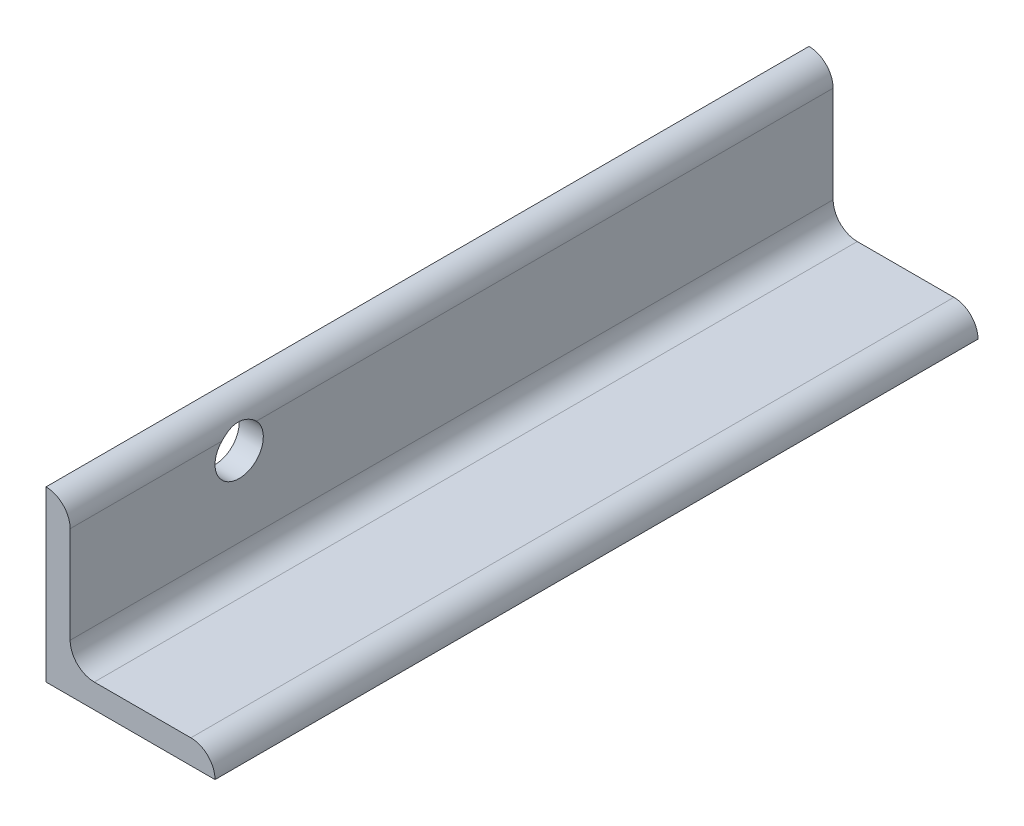
ISO-10303-21;
HEADER;
FILE_DESCRIPTION(('STEP AP214'),'2;1');
FILE_NAME('part.step','',(''),(''),'','','');
FILE_SCHEMA(('AUTOMOTIVE_DESIGN { 1 0 10303 214 1 1 1 1 }'));
ENDSEC;
DATA;
#1=APPLICATION_CONTEXT('core data for automotive mechanical design processes');
#2=APPLICATION_PROTOCOL_DEFINITION('international standard','automotive_design',2000,#1);
#3=PRODUCT_CONTEXT('',#1,'mechanical');
#4=PRODUCT('Part','Part','',(#3));
#5=PRODUCT_RELATED_PRODUCT_CATEGORY('part','',(#4));
#6=PRODUCT_DEFINITION_FORMATION('','',#4);
#7=PRODUCT_DEFINITION_CONTEXT('part definition',#1,'design');
#8=PRODUCT_DEFINITION('design','',#6,#7);
#9=PRODUCT_DEFINITION_SHAPE('','',#8);
#10=(LENGTH_UNIT() NAMED_UNIT(*) SI_UNIT(.MILLI.,.METRE.));
#11=(NAMED_UNIT(*) PLANE_ANGLE_UNIT() SI_UNIT($,.RADIAN.));
#12=(NAMED_UNIT(*) SI_UNIT($,.STERADIAN.) SOLID_ANGLE_UNIT());
#13=UNCERTAINTY_MEASURE_WITH_UNIT(LENGTH_MEASURE(1.E-05),#10,'distance_accuracy_value','');
#14=(GEOMETRIC_REPRESENTATION_CONTEXT(3) GLOBAL_UNCERTAINTY_ASSIGNED_CONTEXT((#13)) GLOBAL_UNIT_ASSIGNED_CONTEXT((#10,
#11,#12)) REPRESENTATION_CONTEXT('',''));
#15=CARTESIAN_POINT('',(0.,0.,0.));
#16=DIRECTION('',(0.,0.,1.));
#17=DIRECTION('',(1.,0.,0.));
#18=AXIS2_PLACEMENT_3D('',#15,#16,#17);
#19=CARTESIAN_POINT('',(0.,35.,-79.));
#20=DIRECTION('',(1.,0.,0.));
#21=DIRECTION('',(0.,0.,-1.));
#22=AXIS2_PLACEMENT_3D('',#19,#20,#21);
#23=PLANE('',#22);
#24=CARTESIAN_POINT('',(0.,26.5,44.));
#25=DIRECTION('',(-1.,0.,0.));
#26=DIRECTION('',(0.,0.,1.));
#27=AXIS2_PLACEMENT_3D('',#24,#25,#26);
#28=CIRCLE('',#27,4.99999999999999);
#29=CARTESIAN_POINT('',(0.,26.5,49.));
#30=VERTEX_POINT('',#29);
#31=EDGE_CURVE('E237',#30,#30,#28,.T.);
#32=ORIENTED_EDGE('',*,*,#31,.F.);
#33=EDGE_LOOP('',(#32));
#34=FACE_BOUND('',#33,.T.);
#35=DIRECTION('',(0.,1.,0.));
#36=VECTOR('',#35,1.);
#37=CARTESIAN_POINT('',(0.,35.,79.));
#38=LINE('',#37,#36);
#39=CARTESIAN_POINT('',(0.,0.,79.));
#40=VERTEX_POINT('',#39);
#41=CARTESIAN_POINT('',(0.,35.,79.));
#42=VERTEX_POINT('',#41);
#43=EDGE_CURVE('E168',#40,#42,#38,.T.);
#44=ORIENTED_EDGE('',*,*,#43,.T.);
#45=DIRECTION('',(0.,0.,1.));
#46=VECTOR('',#45,1.);
#47=CARTESIAN_POINT('',(0.,35.,-79.));
#48=LINE('',#47,#46);
#49=CARTESIAN_POINT('',(0.,35.,-79.));
#50=VERTEX_POINT('',#49);
#51=EDGE_CURVE('E72',#50,#42,#48,.T.);
#52=ORIENTED_EDGE('',*,*,#51,.F.);
#53=DIRECTION('',(0.,1.,0.));
#54=VECTOR('',#53,1.);
#55=CARTESIAN_POINT('',(0.,35.,-79.));
#56=LINE('',#55,#54);
#57=CARTESIAN_POINT('',(0.,0.,-79.));
#58=VERTEX_POINT('',#57);
#59=EDGE_CURVE('E189',#58,#50,#56,.T.);
#60=ORIENTED_EDGE('',*,*,#59,.F.);
#61=DIRECTION('',(0.,0.,1.));
#62=VECTOR('',#61,1.);
#63=CARTESIAN_POINT('',(0.,0.,-79.));
#64=LINE('',#63,#62);
#65=EDGE_CURVE('E164',#58,#40,#64,.T.);
#66=ORIENTED_EDGE('',*,*,#65,.T.);
#67=EDGE_LOOP('',(#44,#52,#60,#66));
#68=FACE_BOUND('',#67,.T.);
#69=ADVANCED_FACE('F64',(#34,#68),#23,.F.);
#70=CARTESIAN_POINT('',(0.,30.,-79.));
#71=DIRECTION('',(0.,0.,1.));
#72=DIRECTION('',(0.,-1.,0.));
#73=AXIS2_PLACEMENT_3D('',#70,#71,#72);
#74=CYLINDRICAL_SURFACE('',#73,5.);
#75=DIRECTION('',(0.,0.,1.));
#76=VECTOR('',#75,1.);
#77=CARTESIAN_POINT('',(5.,30.,-79.));
#78=LINE('',#77,#76);
#79=CARTESIAN_POINT('',(5.,30.,47.5707142142714));
#80=VERTEX_POINT('',#79);
#81=CARTESIAN_POINT('',(5.,30.,79.));
#82=VERTEX_POINT('',#81);
#83=EDGE_CURVE('E200',#80,#82,#78,.T.);
#84=ORIENTED_EDGE('',*,*,#83,.F.);
#85=CARTESIAN_POINT('',(5.,30.,47.5707142142714));
#86=CARTESIAN_POINT('',(4.9999955252737,30.0992819849625,47.473423434583));
#87=CARTESIAN_POINT('',(4.99704325014133,30.1944403785129,47.3720089482987));
#88=CARTESIAN_POINT('',(4.98668256702425,30.3758392116425,47.1618158888214));
#89=CARTESIAN_POINT('',(4.97927715991236,30.4620856110049,47.0530423185313));
#90=CARTESIAN_POINT('',(4.96144893950854,30.6250963501032,46.8289206121453));
#91=CARTESIAN_POINT('',(4.95102718684203,30.7018640092974,46.713574798451));
#92=CARTESIAN_POINT('',(4.92852787951654,30.8455181978565,46.4770183665137));
#93=CARTESIAN_POINT('',(4.91645005287137,30.9124031003649,46.3558067870238));
#94=CARTESIAN_POINT('',(4.89194044083007,31.035795022588,46.1084681135975));
#95=CARTESIAN_POINT('',(4.87950919105075,31.0923168705965,45.9823483611503));
#96=CARTESIAN_POINT('',(4.85544416888814,31.1947517955454,45.7257988298954));
#97=CARTESIAN_POINT('',(4.84381037792748,31.2406651196779,45.5953691515955));
#98=CARTESIAN_POINT('',(4.82237213651918,31.3215440043627,45.3310888911166));
#99=CARTESIAN_POINT('',(4.81256664634913,31.3565157948914,45.1972403027589));
#100=CARTESIAN_POINT('',(4.79561664717994,31.4152731219617,44.9269398601492));
#101=CARTESIAN_POINT('',(4.78847212835649,31.4390586998029,44.7904880155104));
#102=CARTESIAN_POINT('',(4.77740116692676,31.475399769562,44.5146996377305));
#103=CARTESIAN_POINT('',(4.77350452904374,31.4878513467612,44.3753481621218));
#104=CARTESIAN_POINT('',(4.76937628726945,31.5010323459869,44.0960355167987));
#105=CARTESIAN_POINT('',(4.76914470761678,31.5017616904893,43.9560743430583));
#106=CARTESIAN_POINT('',(4.77236719888181,31.4914891406126,43.6765868105425));
#107=CARTESIAN_POINT('',(4.7758223207435,31.4804839011326,43.5370605871297));
#108=CARTESIAN_POINT('',(4.78612026343925,31.4468449187905,43.2595514866308));
#109=CARTESIAN_POINT('',(4.79296302165411,31.4242113908725,43.1215685810654));
#110=CARTESIAN_POINT('',(4.80914542675123,31.3685497131437,42.8531274217182));
#111=CARTESIAN_POINT('',(4.81838493073622,31.3359306790842,42.7225782526745));
#112=CARTESIAN_POINT('',(4.83870619122663,31.2603341486235,42.4646470716953));
#113=CARTESIAN_POINT('',(4.84978864323665,31.2173527388317,42.3372662764053));
#114=CARTESIAN_POINT('',(4.88444592948586,31.0733233823651,41.9612221130374));
#115=CARTESIAN_POINT('',(4.90945709091694,30.9571142603212,41.7182925025755));
#116=CARTESIAN_POINT('',(4.95066993631903,30.7097562793251,41.2929834930599));
#117=CARTESIAN_POINT('',(4.96764565287441,30.5843912878894,41.1072858051597));
#118=CARTESIAN_POINT('',(4.98614159453619,30.3783500662403,40.8423220737439));
#119=CARTESIAN_POINT('',(4.99114604134407,30.3066491489386,40.7562434569024));
#120=CARTESIAN_POINT('',(4.99807507563759,30.1575291307995,40.5889806170967));
#121=CARTESIAN_POINT('',(4.99999800328477,30.0801069717261,40.5077990545358));
#122=CARTESIAN_POINT('',(5.,30.,40.4292857857286));
#123=B_SPLINE_CURVE_WITH_KNOTS('',3,(#85,#86,#87,#88,#89,#90,#91,#92,#93,#94,#95,#96,#97,#98,
#99,#100,#101,#102,#103,#104,#105,#106,#107,#108,#109,#110,#111,#112,#113,#114,#115,#116,#117,
#118,#119,#120,#121,#122),.UNSPECIFIED.,.F.,.F.,(4,2,2,2,2,2,2,2,2,2,2,2,2,2,2,2,2,2,4),(0.,
0.416779785975336,0.833279026987509,1.24963199360785,1.66605342226771,2.08187427044305,
2.49768542847917,2.91325939599305,3.32883182919225,3.74817710786149,4.16752515984134,
4.58699278458508,5.00645265591687,5.41061761437841,5.8149354470259,6.62246422936048,
7.29441636826766,7.63057203833212,7.96690871547757),.UNSPECIFIED.);
#124=CARTESIAN_POINT('',(5.,30.,40.4292857857286));
#125=VERTEX_POINT('',#124);
#126=EDGE_CURVE('E78',#80,#125,#123,.T.);
#127=ORIENTED_EDGE('',*,*,#126,.T.);
#128=CARTESIAN_POINT('',(5.,30.,-79.));
#129=VERTEX_POINT('',#128);
#130=EDGE_CURVE('E201',#129,#125,#78,.T.);
#131=ORIENTED_EDGE('',*,*,#130,.F.);
#132=CARTESIAN_POINT('',(0.,30.,-79.));
#133=DIRECTION('',(0.,0.,-1.));
#134=DIRECTION('',(0.,1.,0.));
#135=AXIS2_PLACEMENT_3D('',#132,#133,#134);
#136=CIRCLE('',#135,5.);
#137=EDGE_CURVE('E125',#50,#129,#136,.T.);
#138=ORIENTED_EDGE('',*,*,#137,.F.);
#139=ORIENTED_EDGE('',*,*,#51,.T.);
#140=CARTESIAN_POINT('',(0.,30.,79.));
#141=DIRECTION('',(0.,0.,-1.));
#142=DIRECTION('',(0.,1.,0.));
#143=AXIS2_PLACEMENT_3D('',#140,#141,#142);
#144=CIRCLE('',#143,5.);
#145=EDGE_CURVE('E172',#42,#82,#144,.T.);
#146=ORIENTED_EDGE('',*,*,#145,.T.);
#147=EDGE_LOOP('',(#84,#127,#131,#138,#139,#146));
#148=FACE_BOUND('',#147,.T.);
#149=ADVANCED_FACE('F207',(#148),#74,.T.);
#150=CARTESIAN_POINT('',(5.,10.,-79.));
#151=DIRECTION('',(-1.,0.,0.));
#152=DIRECTION('',(0.,-1.,0.));
#153=AXIS2_PLACEMENT_3D('',#150,#151,#152);
#154=PLANE('',#153);
#155=ORIENTED_EDGE('',*,*,#130,.T.);
#156=CARTESIAN_POINT('',(5.,26.5,44.));
#157=DIRECTION('',(-1.,0.,0.));
#158=DIRECTION('',(0.,-1.,0.));
#159=AXIS2_PLACEMENT_3D('',#156,#157,#158);
#160=CIRCLE('',#159,4.99999999999999);
#161=EDGE_CURVE('E13',#125,#80,#160,.T.);
#162=ORIENTED_EDGE('',*,*,#161,.T.);
#163=ORIENTED_EDGE('',*,*,#83,.T.);
#164=DIRECTION('',(0.,-1.,0.));
#165=VECTOR('',#164,1.);
#166=CARTESIAN_POINT('',(5.,10.,79.));
#167=LINE('',#166,#165);
#168=CARTESIAN_POINT('',(5.,10.,79.));
#169=VERTEX_POINT('',#168);
#170=EDGE_CURVE('E176',#82,#169,#167,.T.);
#171=ORIENTED_EDGE('',*,*,#170,.T.);
#172=DIRECTION('',(0.,0.,1.));
#173=VECTOR('',#172,1.);
#174=CARTESIAN_POINT('',(5.,10.,-79.));
#175=LINE('',#174,#173);
#176=CARTESIAN_POINT('',(5.,10.,-79.));
#177=VERTEX_POINT('',#176);
#178=EDGE_CURVE('E196',#177,#169,#175,.T.);
#179=ORIENTED_EDGE('',*,*,#178,.F.);
#180=DIRECTION('',(0.,-1.,0.));
#181=VECTOR('',#180,1.);
#182=CARTESIAN_POINT('',(5.,10.,-79.));
#183=LINE('',#182,#181);
#184=EDGE_CURVE('E222',#129,#177,#183,.T.);
#185=ORIENTED_EDGE('',*,*,#184,.F.);
#186=EDGE_LOOP('',(#155,#162,#163,#171,#179,#185));
#187=FACE_BOUND('',#186,.T.);
#188=ADVANCED_FACE('F217',(#187),#154,.F.);
#189=CARTESIAN_POINT('',(10.,10.,-79.));
#190=DIRECTION('',(0.,0.,1.));
#191=DIRECTION('',(0.,-1.,0.));
#192=AXIS2_PLACEMENT_3D('',#189,#190,#191);
#193=CYLINDRICAL_SURFACE('',#192,5.);
#194=CARTESIAN_POINT('',(10.,10.,79.));
#195=DIRECTION('',(0.,0.,1.));
#196=DIRECTION('',(0.,-1.,0.));
#197=AXIS2_PLACEMENT_3D('',#194,#195,#196);
#198=CIRCLE('',#197,5.);
#199=CARTESIAN_POINT('',(10.,5.,79.));
#200=VERTEX_POINT('',#199);
#201=EDGE_CURVE('E179',#169,#200,#198,.T.);
#202=ORIENTED_EDGE('',*,*,#201,.T.);
#203=DIRECTION('',(0.,0.,1.));
#204=VECTOR('',#203,1.);
#205=CARTESIAN_POINT('',(10.,5.00000000000003,-79.));
#206=LINE('',#205,#204);
#207=CARTESIAN_POINT('',(10.,5.00000000000003,-79.));
#208=VERTEX_POINT('',#207);
#209=EDGE_CURVE('E157',#208,#200,#206,.T.);
#210=ORIENTED_EDGE('',*,*,#209,.F.);
#211=CARTESIAN_POINT('',(10.,10.,-79.));
#212=DIRECTION('',(0.,0.,1.));
#213=DIRECTION('',(0.,-1.,0.));
#214=AXIS2_PLACEMENT_3D('',#211,#212,#213);
#215=CIRCLE('',#214,5.);
#216=EDGE_CURVE('E143',#177,#208,#215,.T.);
#217=ORIENTED_EDGE('',*,*,#216,.F.);
#218=ORIENTED_EDGE('',*,*,#178,.T.);
#219=EDGE_LOOP('',(#202,#210,#217,#218));
#220=FACE_BOUND('',#219,.T.);
#221=ADVANCED_FACE('F220',(#220),#193,.F.);
#222=CARTESIAN_POINT('',(30.,5.00000000000002,-79.));
#223=DIRECTION('',(0.,-1.,0.));
#224=DIRECTION('',(0.,0.,-1.));
#225=AXIS2_PLACEMENT_3D('',#222,#223,#224);
#226=PLANE('',#225);
#227=DIRECTION('',(1.,0.,0.));
#228=VECTOR('',#227,1.);
#229=CARTESIAN_POINT('',(30.,5.,79.));
#230=LINE('',#229,#228);
#231=CARTESIAN_POINT('',(30.,5.,79.));
#232=VERTEX_POINT('',#231);
#233=EDGE_CURVE('E153',#200,#232,#230,.T.);
#234=ORIENTED_EDGE('',*,*,#233,.T.);
#235=DIRECTION('',(0.,0.,1.));
#236=VECTOR('',#235,1.);
#237=CARTESIAN_POINT('',(30.,5.00000000000003,-79.));
#238=LINE('',#237,#236);
#239=CARTESIAN_POINT('',(30.,5.00000000000003,-79.));
#240=VERTEX_POINT('',#239);
#241=EDGE_CURVE('E150',#240,#232,#238,.T.);
#242=ORIENTED_EDGE('',*,*,#241,.F.);
#243=DIRECTION('',(1.,0.,0.));
#244=VECTOR('',#243,1.);
#245=CARTESIAN_POINT('',(30.,5.00000000000002,-79.));
#246=LINE('',#245,#244);
#247=EDGE_CURVE('E136',#208,#240,#246,.T.);
#248=ORIENTED_EDGE('',*,*,#247,.F.);
#249=ORIENTED_EDGE('',*,*,#209,.T.);
#250=EDGE_LOOP('',(#234,#242,#248,#249));
#251=FACE_BOUND('',#250,.T.);
#252=ADVANCED_FACE('F151',(#251),#226,.F.);
#253=CARTESIAN_POINT('',(30.,0.,-79.));
#254=DIRECTION('',(0.,0.,1.));
#255=DIRECTION('',(0.,-1.,0.));
#256=AXIS2_PLACEMENT_3D('',#253,#254,#255);
#257=CYLINDRICAL_SURFACE('',#256,5.);
#258=CARTESIAN_POINT('',(30.,0.,79.));
#259=DIRECTION('',(0.,0.,-1.));
#260=DIRECTION('',(0.,-1.,0.));
#261=AXIS2_PLACEMENT_3D('',#258,#259,#260);
#262=CIRCLE('',#261,5.);
#263=CARTESIAN_POINT('',(35.,0.,79.));
#264=VERTEX_POINT('',#263);
#265=EDGE_CURVE('E184',#232,#264,#262,.T.);
#266=ORIENTED_EDGE('',*,*,#265,.T.);
#267=DIRECTION('',(0.,0.,1.));
#268=VECTOR('',#267,1.);
#269=CARTESIAN_POINT('',(35.,0.,-79.));
#270=LINE('',#269,#268);
#271=CARTESIAN_POINT('',(35.,0.,-79.));
#272=VERTEX_POINT('',#271);
#273=EDGE_CURVE('E158',#272,#264,#270,.T.);
#274=ORIENTED_EDGE('',*,*,#273,.F.);
#275=CARTESIAN_POINT('',(30.,0.,-79.));
#276=DIRECTION('',(0.,0.,-1.));
#277=DIRECTION('',(0.,-1.,0.));
#278=AXIS2_PLACEMENT_3D('',#275,#276,#277);
#279=CIRCLE('',#278,5.);
#280=EDGE_CURVE('E140',#240,#272,#279,.T.);
#281=ORIENTED_EDGE('',*,*,#280,.F.);
#282=ORIENTED_EDGE('',*,*,#241,.T.);
#283=EDGE_LOOP('',(#266,#274,#281,#282));
#284=FACE_BOUND('',#283,.T.);
#285=ADVANCED_FACE('F160',(#284),#257,.T.);
#286=CARTESIAN_POINT('',(0.,0.,-79.));
#287=DIRECTION('',(0.,1.,0.));
#288=DIRECTION('',(0.,0.,1.));
#289=AXIS2_PLACEMENT_3D('',#286,#287,#288);
#290=PLANE('',#289);
#291=DIRECTION('',(-1.,0.,0.));
#292=VECTOR('',#291,1.);
#293=CARTESIAN_POINT('',(0.,0.,79.));
#294=LINE('',#293,#292);
#295=EDGE_CURVE('E116',#264,#40,#294,.T.);
#296=ORIENTED_EDGE('',*,*,#295,.T.);
#297=ORIENTED_EDGE('',*,*,#65,.F.);
#298=DIRECTION('',(-1.,0.,0.));
#299=VECTOR('',#298,1.);
#300=CARTESIAN_POINT('',(0.,0.,-79.));
#301=LINE('',#300,#299);
#302=EDGE_CURVE('E86',#272,#58,#301,.T.);
#303=ORIENTED_EDGE('',*,*,#302,.F.);
#304=ORIENTED_EDGE('',*,*,#273,.T.);
#305=EDGE_LOOP('',(#296,#297,#303,#304));
#306=FACE_BOUND('',#305,.T.);
#307=ADVANCED_FACE('F247',(#306),#290,.F.);
#308=CARTESIAN_POINT('',(30.,0.,-79.));
#309=DIRECTION('',(0.,0.,1.));
#310=DIRECTION('',(0.,-1.,0.));
#311=AXIS2_PLACEMENT_3D('',#308,#309,#310);
#312=PLANE('',#311);
#313=ORIENTED_EDGE('',*,*,#59,.T.);
#314=ORIENTED_EDGE('',*,*,#137,.T.);
#315=ORIENTED_EDGE('',*,*,#184,.T.);
#316=ORIENTED_EDGE('',*,*,#216,.T.);
#317=ORIENTED_EDGE('',*,*,#247,.T.);
#318=ORIENTED_EDGE('',*,*,#280,.T.);
#319=ORIENTED_EDGE('',*,*,#302,.T.);
#320=EDGE_LOOP('',(#313,#314,#315,#316,#317,#318,#319));
#321=FACE_BOUND('',#320,.T.);
#322=ADVANCED_FACE('F138',(#321),#312,.F.);
#323=CARTESIAN_POINT('',(30.,0.,79.));
#324=DIRECTION('',(0.,0.,1.));
#325=DIRECTION('',(0.,-1.,0.));
#326=AXIS2_PLACEMENT_3D('',#323,#324,#325);
#327=PLANE('',#326);
#328=ORIENTED_EDGE('',*,*,#43,.F.);
#329=ORIENTED_EDGE('',*,*,#295,.F.);
#330=ORIENTED_EDGE('',*,*,#265,.F.);
#331=ORIENTED_EDGE('',*,*,#233,.F.);
#332=ORIENTED_EDGE('',*,*,#201,.F.);
#333=ORIENTED_EDGE('',*,*,#170,.F.);
#334=ORIENTED_EDGE('',*,*,#145,.F.);
#335=EDGE_LOOP('',(#328,#329,#330,#331,#332,#333,#334));
#336=FACE_BOUND('',#335,.T.);
#337=ADVANCED_FACE('F213',(#336),#327,.T.);
#338=CARTESIAN_POINT('',(10.,26.5,44.));
#339=DIRECTION('',(-1.,0.,0.));
#340=DIRECTION('',(0.,0.,1.));
#341=AXIS2_PLACEMENT_3D('',#338,#339,#340);
#342=CYLINDRICAL_SURFACE('',#341,4.99999999999999);
#343=ORIENTED_EDGE('',*,*,#31,.T.);
#344=EDGE_LOOP('',(#343));
#345=FACE_BOUND('',#344,.T.);
#346=ORIENTED_EDGE('',*,*,#161,.F.);
#347=ORIENTED_EDGE('',*,*,#126,.F.);
#348=EDGE_LOOP('',(#346,#347));
#349=FACE_BOUND('',#348,.T.);
#350=ADVANCED_FACE('F240',(#345,#349),#342,.F.);
#351=CLOSED_SHELL('',(#69,#149,#188,#221,#252,#285,#307,#322,#337,#350));
#352=MANIFOLD_SOLID_BREP('B2',#351);
#353=ADVANCED_BREP_SHAPE_REPRESENTATION('',(#18,#352),#14);
#354=SHAPE_DEFINITION_REPRESENTATION(#9,#353);
ENDSEC;
END-ISO-10303-21;
